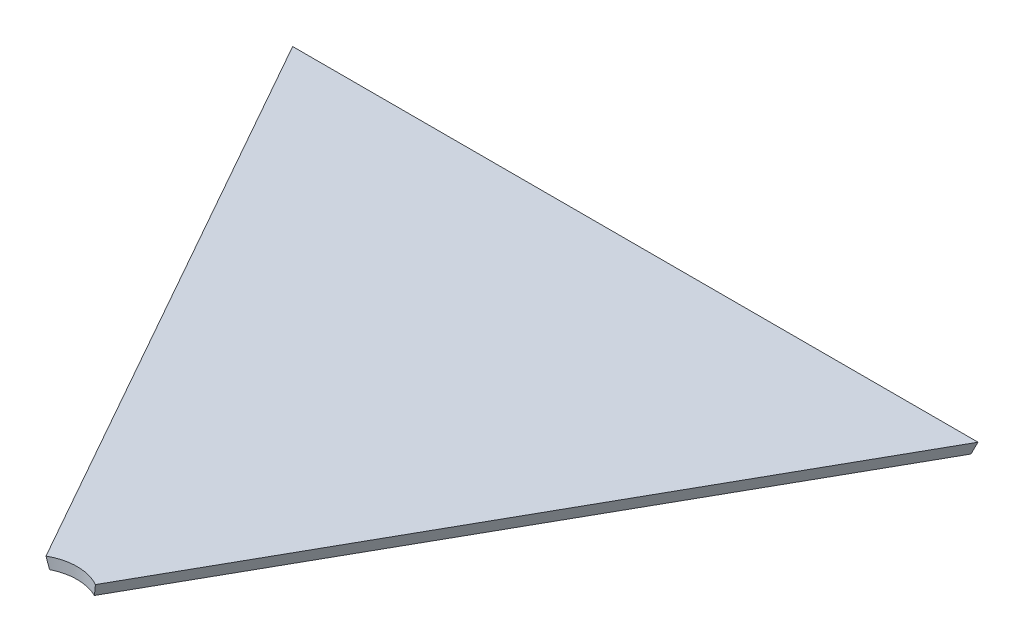
ISO-10303-21;
HEADER;
FILE_DESCRIPTION(('STEP AP214'),'2;1');
FILE_NAME('part.step','',(''),(''),'','','');
FILE_SCHEMA(('AUTOMOTIVE_DESIGN { 1 0 10303 214 1 1 1 1 }'));
ENDSEC;
DATA;
#1=APPLICATION_CONTEXT('core data for automotive mechanical design processes');
#2=APPLICATION_PROTOCOL_DEFINITION('international standard','automotive_design',2000,#1);
#3=PRODUCT_CONTEXT('',#1,'mechanical');
#4=PRODUCT('Part','Part','',(#3));
#5=PRODUCT_RELATED_PRODUCT_CATEGORY('part','',(#4));
#6=PRODUCT_DEFINITION_FORMATION('','',#4);
#7=PRODUCT_DEFINITION_CONTEXT('part definition',#1,'design');
#8=PRODUCT_DEFINITION('design','',#6,#7);
#9=PRODUCT_DEFINITION_SHAPE('','',#8);
#10=(LENGTH_UNIT() NAMED_UNIT(*) SI_UNIT(.MILLI.,.METRE.));
#11=(NAMED_UNIT(*) PLANE_ANGLE_UNIT() SI_UNIT($,.RADIAN.));
#12=(NAMED_UNIT(*) SI_UNIT($,.STERADIAN.) SOLID_ANGLE_UNIT());
#13=UNCERTAINTY_MEASURE_WITH_UNIT(LENGTH_MEASURE(1.E-05),#10,'distance_accuracy_value','');
#14=(GEOMETRIC_REPRESENTATION_CONTEXT(3) GLOBAL_UNCERTAINTY_ASSIGNED_CONTEXT((#13)) GLOBAL_UNIT_ASSIGNED_CONTEXT((#10,
#11,#12)) REPRESENTATION_CONTEXT('',''));
#15=CARTESIAN_POINT('',(0.,0.,0.));
#16=DIRECTION('',(0.,0.,1.));
#17=DIRECTION('',(1.,0.,0.));
#18=AXIS2_PLACEMENT_3D('',#15,#16,#17);
#19=CARTESIAN_POINT('',(1.11022302462516E-13,10.,543.4));
#20=DIRECTION('',(0.,-1.,0.));
#21=DIRECTION('',(0.,0.,-1.));
#22=AXIS2_PLACEMENT_3D('',#19,#20,#21);
#23=CYLINDRICAL_SURFACE('',#22,45.);
#24=CARTESIAN_POINT('',(1.11022302462516E-13,10.,543.4));
#25=DIRECTION('',(0.,-1.,0.));
#26=DIRECTION('',(0.,0.,1.));
#27=AXIS2_PLACEMENT_3D('',#24,#25,#26);
#28=CIRCLE('',#27,45.);
#29=CARTESIAN_POINT('',(-22.0783075161302,10.,504.188415777692));
#30=VERTEX_POINT('',#29);
#31=CARTESIAN_POINT('',(22.0783075161304,10.,504.188415777692));
#32=VERTEX_POINT('',#31);
#33=EDGE_CURVE('E85',#30,#32,#28,.T.);
#34=ORIENTED_EDGE('',*,*,#33,.F.);
#35=CARTESIAN_POINT('',(1.11022302462516E-13,10.0104235819033,543.4));
#36=DIRECTION('',(0.849009852877128,0.224951054343863,-0.478099668340339));
#37=DIRECTION('',(0.196009368981521,-0.974370064785236,-0.110378005607465));
#38=AXIS2_PLACEMENT_3D('',#35,#36,#37);
#39=ELLIPSE('',#38,200.043516716363,45.);
#40=CARTESIAN_POINT('',(-20.0375165351967,0.,503.107346437574));
#41=VERTEX_POINT('',#40);
#42=EDGE_CURVE('E73',#30,#41,#39,.F.);
#43=ORIENTED_EDGE('',*,*,#42,.T.);
#44=CARTESIAN_POINT('',(1.11022302462516E-13,0.,543.4));
#45=DIRECTION('',(0.,-1.,0.));
#46=DIRECTION('',(0.,0.,1.));
#47=AXIS2_PLACEMENT_3D('',#44,#45,#46);
#48=CIRCLE('',#47,45.);
#49=CARTESIAN_POINT('',(20.0375165351969,0.,503.107346437573));
#50=VERTEX_POINT('',#49);
#51=EDGE_CURVE('E95',#41,#50,#48,.T.);
#52=ORIENTED_EDGE('',*,*,#51,.T.);
#53=CARTESIAN_POINT('',(1.11022302462516E-13,10.010423581903,543.4));
#54=DIRECTION('',(-0.849009852877128,0.224951054343863,-0.478099668340339));
#55=DIRECTION('',(-0.196009368981521,-0.974370064785236,-0.110378005607464));
#56=AXIS2_PLACEMENT_3D('',#53,#54,#55);
#57=ELLIPSE('',#56,200.043516716363,45.);
#58=EDGE_CURVE('E82',#50,#32,#57,.F.);
#59=ORIENTED_EDGE('',*,*,#58,.T.);
#60=EDGE_LOOP('',(#34,#43,#52,#59));
#61=FACE_BOUND('',#60,.T.);
#62=ADVANCED_FACE('F34',(#61),#23,.F.);
#63=CARTESIAN_POINT('',(1.11022302462516E-13,10.,543.4));
#64=DIRECTION('',(0.,1.,0.));
#65=DIRECTION('',(0.,0.,1.));
#66=AXIS2_PLACEMENT_3D('',#63,#64,#65);
#67=PLANE('',#66);
#68=DIRECTION('',(0.490675653552348,0.,0.871342299564859));
#69=VECTOR('',#68,1.);
#70=CARTESIAN_POINT('',(-306.,10.,0.));
#71=LINE('',#70,#69);
#72=CARTESIAN_POINT('',(-306.,10.,0.));
#73=VERTEX_POINT('',#72);
#74=EDGE_CURVE('E78',#73,#30,#71,.T.);
#75=ORIENTED_EDGE('',*,*,#74,.T.);
#76=ORIENTED_EDGE('',*,*,#33,.T.);
#77=DIRECTION('',(0.490675653552348,0.,-0.871342299564859));
#78=VECTOR('',#77,1.);
#79=CARTESIAN_POINT('',(306.,10.,0.));
#80=LINE('',#79,#78);
#81=CARTESIAN_POINT('',(306.,10.,0.));
#82=VERTEX_POINT('',#81);
#83=EDGE_CURVE('E89',#32,#82,#80,.T.);
#84=ORIENTED_EDGE('',*,*,#83,.T.);
#85=DIRECTION('',(-1.,0.,0.));
#86=VECTOR('',#85,1.);
#87=CARTESIAN_POINT('',(-306.,10.,0.));
#88=LINE('',#87,#86);
#89=EDGE_CURVE('E93',#82,#73,#88,.T.);
#90=ORIENTED_EDGE('',*,*,#89,.T.);
#91=EDGE_LOOP('',(#75,#76,#84,#90));
#92=FACE_BOUND('',#91,.T.);
#93=ADVANCED_FACE('F91',(#92),#67,.T.);
#94=CARTESIAN_POINT('',(1.11022302462516E-13,0.,543.4));
#95=DIRECTION('',(0.,1.,0.));
#96=DIRECTION('',(0.,0.,1.));
#97=AXIS2_PLACEMENT_3D('',#94,#95,#96);
#98=PLANE('',#97);
#99=ORIENTED_EDGE('',*,*,#51,.F.);
#100=DIRECTION('',(-0.490675653552348,0.,-0.871342299564859));
#101=VECTOR('',#100,1.);
#102=CARTESIAN_POINT('',(2.01374906766985,0.,542.266005196393));
#103=LINE('',#102,#101);
#104=CARTESIAN_POINT('',(-302.05035137325,0.,2.3086819112557));
#105=VERTEX_POINT('',#104);
#106=EDGE_CURVE('E11',#41,#105,#103,.T.);
#107=ORIENTED_EDGE('',*,*,#106,.T.);
#108=DIRECTION('',(1.,0.,0.));
#109=VECTOR('',#108,1.);
#110=CARTESIAN_POINT('',(0.,0.,2.30868191125566));
#111=LINE('',#110,#109);
#112=CARTESIAN_POINT('',(302.05035137325,0.,2.30868191125562));
#113=VERTEX_POINT('',#112);
#114=EDGE_CURVE('E44',#105,#113,#111,.T.);
#115=ORIENTED_EDGE('',*,*,#114,.T.);
#116=DIRECTION('',(-0.490675653552348,0.,0.871342299564859));
#117=VECTOR('',#116,1.);
#118=CARTESIAN_POINT('',(-2.01374906766964,0.,542.266005196393));
#119=LINE('',#118,#117);
#120=EDGE_CURVE('E81',#113,#50,#119,.T.);
#121=ORIENTED_EDGE('',*,*,#120,.T.);
#122=EDGE_LOOP('',(#99,#107,#115,#121));
#123=FACE_BOUND('',#122,.T.);
#124=ADVANCED_FACE('F109',(#123),#98,.F.);
#125=CARTESIAN_POINT('',(306.,10.,0.));
#126=DIRECTION('',(-0.849009852877128,0.224951054343863,-0.478099668340339));
#127=DIRECTION('',(0.490675653552348,0.,-0.871342299564859));
#128=AXIS2_PLACEMENT_3D('',#125,#126,#127);
#129=PLANE('',#128);
#130=ORIENTED_EDGE('',*,*,#58,.F.);
#131=ORIENTED_EDGE('',*,*,#120,.F.);
#132=DIRECTION('',(0.359163262569548,0.909354974356526,-0.20994113802073));
#133=VECTOR('',#132,1.);
#134=CARTESIAN_POINT('',(306.,10.,0.));
#135=LINE('',#134,#133);
#136=EDGE_CURVE('E39',#82,#113,#135,.F.);
#137=ORIENTED_EDGE('',*,*,#136,.F.);
#138=ORIENTED_EDGE('',*,*,#83,.F.);
#139=EDGE_LOOP('',(#130,#131,#137,#138));
#140=FACE_BOUND('',#139,.T.);
#141=ADVANCED_FACE('F37',(#140),#129,.F.);
#142=CARTESIAN_POINT('',(-306.,10.,0.));
#143=DIRECTION('',(0.,0.224951054343871,0.974370064785234));
#144=DIRECTION('',(-1.,0.,0.));
#145=AXIS2_PLACEMENT_3D('',#142,#143,#144);
#146=PLANE('',#145);
#147=ORIENTED_EDGE('',*,*,#136,.T.);
#148=ORIENTED_EDGE('',*,*,#114,.F.);
#149=DIRECTION('',(-0.359163262569548,0.909354974356526,-0.20994113802073));
#150=VECTOR('',#149,1.);
#151=CARTESIAN_POINT('',(-306.,10.,0.));
#152=LINE('',#151,#150);
#153=EDGE_CURVE('E103',#73,#105,#152,.F.);
#154=ORIENTED_EDGE('',*,*,#153,.F.);
#155=ORIENTED_EDGE('',*,*,#89,.F.);
#156=EDGE_LOOP('',(#147,#148,#154,#155));
#157=FACE_BOUND('',#156,.T.);
#158=ADVANCED_FACE('F107',(#157),#146,.F.);
#159=CARTESIAN_POINT('',(-306.,10.,0.));
#160=DIRECTION('',(0.849009852877128,0.224951054343863,-0.478099668340339));
#161=DIRECTION('',(0.490675653552348,0.,0.871342299564859));
#162=AXIS2_PLACEMENT_3D('',#159,#160,#161);
#163=PLANE('',#162);
#164=ORIENTED_EDGE('',*,*,#153,.T.);
#165=ORIENTED_EDGE('',*,*,#106,.F.);
#166=ORIENTED_EDGE('',*,*,#42,.F.);
#167=ORIENTED_EDGE('',*,*,#74,.F.);
#168=EDGE_LOOP('',(#164,#165,#166,#167));
#169=FACE_BOUND('',#168,.T.);
#170=ADVANCED_FACE('F76',(#169),#163,.F.);
#171=CLOSED_SHELL('',(#62,#93,#124,#141,#158,#170));
#172=MANIFOLD_SOLID_BREP('B2',#171);
#173=ADVANCED_BREP_SHAPE_REPRESENTATION('',(#18,#172),#14);
#174=SHAPE_DEFINITION_REPRESENTATION(#9,#173);
ENDSEC;
END-ISO-10303-21;
